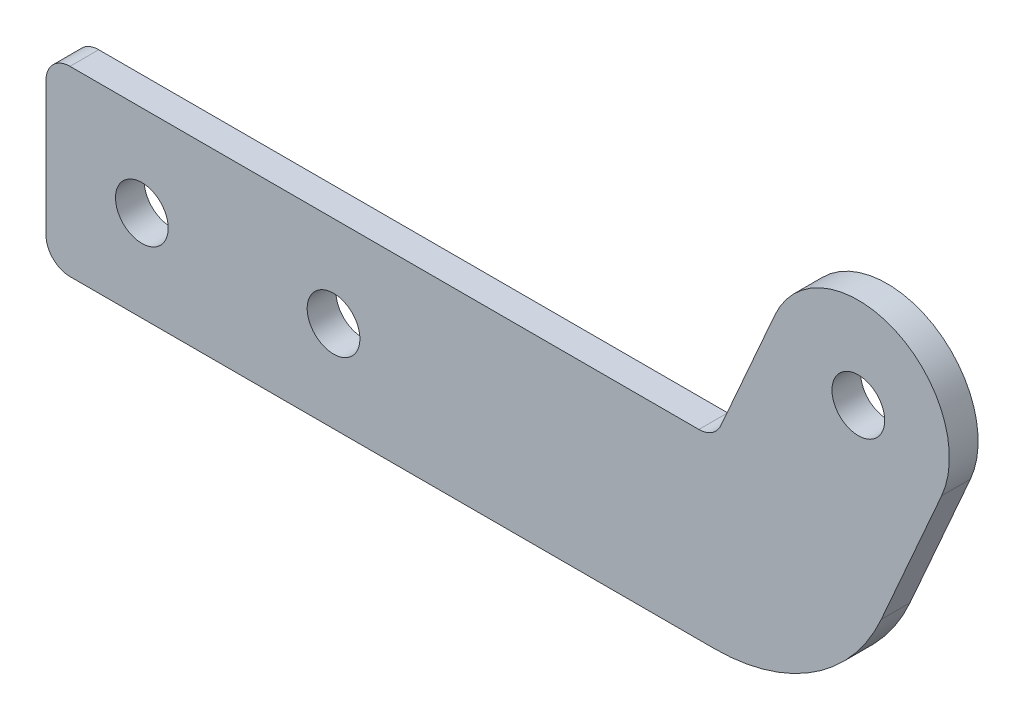
ISO-10303-21;
HEADER;
FILE_DESCRIPTION(('STEP AP214'),'2;1');
FILE_NAME('part.step','',(''),(''),'','','');
FILE_SCHEMA(('AUTOMOTIVE_DESIGN { 1 0 10303 214 1 1 1 1 }'));
ENDSEC;
DATA;
#1=APPLICATION_CONTEXT('core data for automotive mechanical design processes');
#2=APPLICATION_PROTOCOL_DEFINITION('international standard','automotive_design',2000,#1);
#3=PRODUCT_CONTEXT('',#1,'mechanical');
#4=PRODUCT('Part','Part','',(#3));
#5=PRODUCT_RELATED_PRODUCT_CATEGORY('part','',(#4));
#6=PRODUCT_DEFINITION_FORMATION('','',#4);
#7=PRODUCT_DEFINITION_CONTEXT('part definition',#1,'design');
#8=PRODUCT_DEFINITION('design','',#6,#7);
#9=PRODUCT_DEFINITION_SHAPE('','',#8);
#10=(LENGTH_UNIT() NAMED_UNIT(*) SI_UNIT(.MILLI.,.METRE.));
#11=(NAMED_UNIT(*) PLANE_ANGLE_UNIT() SI_UNIT($,.RADIAN.));
#12=(NAMED_UNIT(*) SI_UNIT($,.STERADIAN.) SOLID_ANGLE_UNIT());
#13=UNCERTAINTY_MEASURE_WITH_UNIT(LENGTH_MEASURE(1.E-05),#10,'distance_accuracy_value','');
#14=(GEOMETRIC_REPRESENTATION_CONTEXT(3) GLOBAL_UNCERTAINTY_ASSIGNED_CONTEXT((#13)) GLOBAL_UNIT_ASSIGNED_CONTEXT((#10,
#11,#12)) REPRESENTATION_CONTEXT('',''));
#15=CARTESIAN_POINT('',(0.,0.,0.));
#16=DIRECTION('',(0.,0.,1.));
#17=DIRECTION('',(1.,0.,0.));
#18=AXIS2_PLACEMENT_3D('',#15,#16,#17);
#19=CARTESIAN_POINT('',(-15.,-29.5,3.));
#20=DIRECTION('',(0.,1.,0.));
#21=DIRECTION('',(0.,0.,1.));
#22=AXIS2_PLACEMENT_3D('',#19,#20,#21);
#23=PLANE('',#22);
#24=DIRECTION('',(1.,0.,0.));
#25=VECTOR('',#24,1.);
#26=CARTESIAN_POINT('',(-15.,-29.5,3.));
#27=LINE('',#26,#25);
#28=CARTESIAN_POINT('',(-82.25,-29.5,3.));
#29=VERTEX_POINT('',#28);
#30=CARTESIAN_POINT('',(-15.,-29.5,3.));
#31=VERTEX_POINT('',#30);
#32=EDGE_CURVE('E108',#29,#31,#27,.T.);
#33=ORIENTED_EDGE('',*,*,#32,.F.);
#34=DIRECTION('',(0.,0.,-1.));
#35=VECTOR('',#34,1.);
#36=CARTESIAN_POINT('',(-82.25,-29.5,3.));
#37=LINE('',#36,#35);
#38=CARTESIAN_POINT('',(-82.25,-29.5,0.));
#39=VERTEX_POINT('',#38);
#40=EDGE_CURVE('E134',#29,#39,#37,.T.);
#41=ORIENTED_EDGE('',*,*,#40,.T.);
#42=DIRECTION('',(1.,0.,0.));
#43=VECTOR('',#42,1.);
#44=CARTESIAN_POINT('',(-15.,-29.5,0.));
#45=LINE('',#44,#43);
#46=CARTESIAN_POINT('',(-15.,-29.5,0.));
#47=VERTEX_POINT('',#46);
#48=EDGE_CURVE('E132',#39,#47,#45,.T.);
#49=ORIENTED_EDGE('',*,*,#48,.T.);
#50=DIRECTION('',(0.,0.,-1.));
#51=VECTOR('',#50,1.);
#52=CARTESIAN_POINT('',(-15.,-29.5,3.));
#53=LINE('',#52,#51);
#54=EDGE_CURVE('E125',#31,#47,#53,.T.);
#55=ORIENTED_EDGE('',*,*,#54,.F.);
#56=EDGE_LOOP('',(#33,#41,#49,#55));
#57=FACE_BOUND('',#56,.T.);
#58=ADVANCED_FACE('F33',(#57),#23,.F.);
#59=CARTESIAN_POINT('',(-15.,-10.5,3.));
#60=DIRECTION('',(0.,0.,-1.));
#61=DIRECTION('',(-1.,0.,0.));
#62=AXIS2_PLACEMENT_3D('',#59,#60,#61);
#63=CYLINDRICAL_SURFACE('',#62,19.);
#64=CARTESIAN_POINT('',(-15.,-10.5,0.));
#65=DIRECTION('',(0.,0.,1.));
#66=DIRECTION('',(-1.,0.,0.));
#67=AXIS2_PLACEMENT_3D('',#64,#65,#66);
#68=CIRCLE('',#67,19.);
#69=CARTESIAN_POINT('',(2.39051135146438,-18.1531114544731,0.));
#70=VERTEX_POINT('',#69);
#71=EDGE_CURVE('E189',#47,#70,#68,.T.);
#72=ORIENTED_EDGE('',*,*,#71,.T.);
#73=DIRECTION('',(0.,0.,-1.));
#74=VECTOR('',#73,1.);
#75=CARTESIAN_POINT('',(2.39051135146438,-18.1531114544731,3.));
#76=LINE('',#75,#74);
#77=CARTESIAN_POINT('',(2.39051135146438,-18.1531114544731,3.));
#78=VERTEX_POINT('',#77);
#79=EDGE_CURVE('E127',#78,#70,#76,.T.);
#80=ORIENTED_EDGE('',*,*,#79,.F.);
#81=CARTESIAN_POINT('',(-15.,-10.5,3.));
#82=DIRECTION('',(0.,0.,1.));
#83=DIRECTION('',(-1.,0.,0.));
#84=AXIS2_PLACEMENT_3D('',#81,#82,#83);
#85=CIRCLE('',#84,19.);
#86=EDGE_CURVE('E112',#31,#78,#85,.T.);
#87=ORIENTED_EDGE('',*,*,#86,.F.);
#88=ORIENTED_EDGE('',*,*,#54,.T.);
#89=EDGE_LOOP('',(#72,#80,#87,#88));
#90=FACE_BOUND('',#89,.T.);
#91=ADVANCED_FACE('F124',(#90),#63,.T.);
#92=CARTESIAN_POINT('',(8.69525567573224,-3.82655572723657,3.));
#93=DIRECTION('',(-0.915290071129705,0.402795339709112,0.));
#94=DIRECTION('',(-0.402795339709112,-0.915290071129706,0.));
#95=AXIS2_PLACEMENT_3D('',#92,#93,#94);
#96=PLANE('',#95);
#97=DIRECTION('',(0.402795339709112,0.915290071129706,0.));
#98=VECTOR('',#97,1.);
#99=CARTESIAN_POINT('',(8.69525567573224,-3.82655572723657,0.));
#100=LINE('',#99,#98);
#101=CARTESIAN_POINT('',(8.69525567573224,-3.82655572723657,0.));
#102=VERTEX_POINT('',#101);
#103=EDGE_CURVE('E192',#70,#102,#100,.T.);
#104=ORIENTED_EDGE('',*,*,#103,.T.);
#105=DIRECTION('',(0.,0.,-1.));
#106=VECTOR('',#105,1.);
#107=CARTESIAN_POINT('',(8.69525567573224,-3.82655572723657,3.));
#108=LINE('',#107,#106);
#109=CARTESIAN_POINT('',(8.69525567573224,-3.82655572723657,3.));
#110=VERTEX_POINT('',#109);
#111=EDGE_CURVE('E138',#110,#102,#108,.T.);
#112=ORIENTED_EDGE('',*,*,#111,.F.);
#113=DIRECTION('',(0.402795339709112,0.915290071129706,0.));
#114=VECTOR('',#113,1.);
#115=CARTESIAN_POINT('',(8.69525567573224,-3.82655572723657,3.));
#116=LINE('',#115,#114);
#117=EDGE_CURVE('E129',#78,#110,#116,.T.);
#118=ORIENTED_EDGE('',*,*,#117,.F.);
#119=ORIENTED_EDGE('',*,*,#79,.T.);
#120=EDGE_LOOP('',(#104,#112,#118,#119));
#121=FACE_BOUND('',#120,.T.);
#122=ADVANCED_FACE('F205',(#121),#96,.F.);
#123=CARTESIAN_POINT('',(0.,0.,3.));
#124=DIRECTION('',(0.,0.,-1.));
#125=DIRECTION('',(-1.,0.,0.));
#126=AXIS2_PLACEMENT_3D('',#123,#124,#125);
#127=CYLINDRICAL_SURFACE('',#126,9.50000000000004);
#128=CARTESIAN_POINT('',(0.,0.,0.));
#129=DIRECTION('',(0.,0.,1.));
#130=DIRECTION('',(1.,0.,0.));
#131=AXIS2_PLACEMENT_3D('',#128,#129,#130);
#132=CIRCLE('',#131,9.50000000000004);
#133=CARTESIAN_POINT('',(-8.69525567573223,3.82655572723657,0.));
#134=VERTEX_POINT('',#133);
#135=EDGE_CURVE('E175',#102,#134,#132,.T.);
#136=ORIENTED_EDGE('',*,*,#135,.T.);
#137=DIRECTION('',(0.,0.,-1.));
#138=VECTOR('',#137,1.);
#139=CARTESIAN_POINT('',(-8.69525567573223,3.82655572723657,3.));
#140=LINE('',#139,#138);
#141=CARTESIAN_POINT('',(-8.69525567573223,3.82655572723657,3.));
#142=VERTEX_POINT('',#141);
#143=EDGE_CURVE('E174',#142,#134,#140,.T.);
#144=ORIENTED_EDGE('',*,*,#143,.F.);
#145=CARTESIAN_POINT('',(0.,0.,3.));
#146=DIRECTION('',(0.,0.,1.));
#147=DIRECTION('',(1.,0.,0.));
#148=AXIS2_PLACEMENT_3D('',#145,#146,#147);
#149=CIRCLE('',#148,9.50000000000004);
#150=EDGE_CURVE('E184',#110,#142,#149,.T.);
#151=ORIENTED_EDGE('',*,*,#150,.F.);
#152=ORIENTED_EDGE('',*,*,#111,.T.);
#153=EDGE_LOOP('',(#136,#144,#151,#152));
#154=FACE_BOUND('',#153,.T.);
#155=ADVANCED_FACE('F202',(#154),#127,.T.);
#156=CARTESIAN_POINT('',(-15.,-10.5,3.));
#157=DIRECTION('',(0.915290071129708,-0.402795339709105,0.));
#158=DIRECTION('',(0.402795339709105,0.915290071129709,0.));
#159=AXIS2_PLACEMENT_3D('',#156,#157,#158);
#160=PLANE('',#159);
#161=DIRECTION('',(-0.402795339709105,-0.915290071129708,0.));
#162=VECTOR('',#161,1.);
#163=CARTESIAN_POINT('',(-15.,-10.5,0.));
#164=LINE('',#163,#162);
#165=CARTESIAN_POINT('',(-14.3429644284221,-9.00698834927277,0.));
#166=VERTEX_POINT('',#165);
#167=EDGE_CURVE('E164',#134,#166,#164,.T.);
#168=ORIENTED_EDGE('',*,*,#167,.T.);
#169=DIRECTION('',(0.,0.,-1.));
#170=VECTOR('',#169,1.);
#171=CARTESIAN_POINT('',(-14.3429644284221,-9.00698834927277,3.));
#172=LINE('',#171,#170);
#173=CARTESIAN_POINT('',(-14.3429644284221,-9.00698834927277,3.));
#174=VERTEX_POINT('',#173);
#175=EDGE_CURVE('E157',#166,#174,#172,.F.);
#176=ORIENTED_EDGE('',*,*,#175,.T.);
#177=DIRECTION('',(-0.402795339709105,-0.915290071129708,0.));
#178=VECTOR('',#177,1.);
#179=CARTESIAN_POINT('',(-15.,-10.5,3.));
#180=LINE('',#179,#178);
#181=EDGE_CURVE('E181',#142,#174,#180,.T.);
#182=ORIENTED_EDGE('',*,*,#181,.F.);
#183=ORIENTED_EDGE('',*,*,#143,.T.);
#184=EDGE_LOOP('',(#168,#176,#182,#183));
#185=FACE_BOUND('',#184,.T.);
#186=ADVANCED_FACE('F171',(#185),#160,.F.);
#187=CARTESIAN_POINT('',(-84.75,-10.5,3.));
#188=DIRECTION('',(0.,-1.,0.));
#189=DIRECTION('',(0.,0.,-1.));
#190=AXIS2_PLACEMENT_3D('',#187,#188,#189);
#191=PLANE('',#190);
#192=DIRECTION('',(-1.,0.,0.));
#193=VECTOR('',#192,1.);
#194=CARTESIAN_POINT('',(-84.75,-10.5,0.));
#195=LINE('',#194,#193);
#196=CARTESIAN_POINT('',(-16.6311896062463,-10.5,0.));
#197=VERTEX_POINT('',#196);
#198=CARTESIAN_POINT('',(-82.25,-10.5,0.));
#199=VERTEX_POINT('',#198);
#200=EDGE_CURVE('E165',#197,#199,#195,.T.);
#201=ORIENTED_EDGE('',*,*,#200,.T.);
#202=DIRECTION('',(0.,0.,-1.));
#203=VECTOR('',#202,1.);
#204=CARTESIAN_POINT('',(-82.25,-10.5,3.));
#205=LINE('',#204,#203);
#206=CARTESIAN_POINT('',(-82.25,-10.5,3.));
#207=VERTEX_POINT('',#206);
#208=EDGE_CURVE('E48',#199,#207,#205,.F.);
#209=ORIENTED_EDGE('',*,*,#208,.T.);
#210=DIRECTION('',(-1.,0.,0.));
#211=VECTOR('',#210,1.);
#212=CARTESIAN_POINT('',(-84.75,-10.5,3.));
#213=LINE('',#212,#211);
#214=CARTESIAN_POINT('',(-16.6311896062463,-10.5,3.));
#215=VERTEX_POINT('',#214);
#216=EDGE_CURVE('E178',#215,#207,#213,.T.);
#217=ORIENTED_EDGE('',*,*,#216,.F.);
#218=DIRECTION('',(0.,0.,-1.));
#219=VECTOR('',#218,1.);
#220=CARTESIAN_POINT('',(-16.6311896062463,-10.5,0.));
#221=LINE('',#220,#219);
#222=EDGE_CURVE('E153',#215,#197,#221,.T.);
#223=ORIENTED_EDGE('',*,*,#222,.T.);
#224=EDGE_LOOP('',(#201,#209,#217,#223));
#225=FACE_BOUND('',#224,.T.);
#226=ADVANCED_FACE('F177',(#225),#191,.F.);
#227=CARTESIAN_POINT('',(-84.75,-10.5,3.));
#228=DIRECTION('',(1.,0.,0.));
#229=DIRECTION('',(0.,0.,-1.));
#230=AXIS2_PLACEMENT_3D('',#227,#228,#229);
#231=PLANE('',#230);
#232=DIRECTION('',(0.,-1.,0.));
#233=VECTOR('',#232,1.);
#234=CARTESIAN_POINT('',(-84.75,-10.5,0.));
#235=LINE('',#234,#233);
#236=CARTESIAN_POINT('',(-84.75,-13.,0.));
#237=VERTEX_POINT('',#236);
#238=CARTESIAN_POINT('',(-84.75,-27.,0.));
#239=VERTEX_POINT('',#238);
#240=EDGE_CURVE('E120',#237,#239,#235,.T.);
#241=ORIENTED_EDGE('',*,*,#240,.T.);
#242=DIRECTION('',(0.,0.,-1.));
#243=VECTOR('',#242,1.);
#244=CARTESIAN_POINT('',(-84.75,-27.,3.));
#245=LINE('',#244,#243);
#246=CARTESIAN_POINT('',(-84.75,-27.,3.));
#247=VERTEX_POINT('',#246);
#248=EDGE_CURVE('E148',#239,#247,#245,.F.);
#249=ORIENTED_EDGE('',*,*,#248,.T.);
#250=DIRECTION('',(0.,-1.,0.));
#251=VECTOR('',#250,1.);
#252=CARTESIAN_POINT('',(-84.75,-10.5,3.));
#253=LINE('',#252,#251);
#254=CARTESIAN_POINT('',(-84.75,-13.,3.));
#255=VERTEX_POINT('',#254);
#256=EDGE_CURVE('E180',#255,#247,#253,.T.);
#257=ORIENTED_EDGE('',*,*,#256,.F.);
#258=DIRECTION('',(0.,0.,-1.));
#259=VECTOR('',#258,1.);
#260=CARTESIAN_POINT('',(-84.75,-13.,3.));
#261=LINE('',#260,#259);
#262=EDGE_CURVE('E145',#255,#237,#261,.T.);
#263=ORIENTED_EDGE('',*,*,#262,.T.);
#264=EDGE_LOOP('',(#241,#249,#257,#263));
#265=FACE_BOUND('',#264,.T.);
#266=ADVANCED_FACE('F230',(#265),#231,.F.);
#267=CARTESIAN_POINT('',(0.,0.,3.));
#268=DIRECTION('',(0.,0.,1.));
#269=DIRECTION('',(1.,0.,0.));
#270=AXIS2_PLACEMENT_3D('',#267,#268,#269);
#271=PLANE('',#270);
#272=CARTESIAN_POINT('',(0.,0.,3.));
#273=DIRECTION('',(0.,0.,1.));
#274=DIRECTION('',(1.,0.,0.));
#275=AXIS2_PLACEMENT_3D('',#272,#273,#274);
#276=CIRCLE('',#275,2.74999999999999);
#277=CARTESIAN_POINT('',(2.74999999999999,0.,3.));
#278=VERTEX_POINT('',#277);
#279=EDGE_CURVE('E222',#278,#278,#276,.T.);
#280=ORIENTED_EDGE('',*,*,#279,.F.);
#281=EDGE_LOOP('',(#280));
#282=FACE_BOUND('',#281,.T.);
#283=CARTESIAN_POINT('',(-54.75,-20.,3.));
#284=DIRECTION('',(0.,0.,1.));
#285=DIRECTION('',(1.,0.,0.));
#286=AXIS2_PLACEMENT_3D('',#283,#284,#285);
#287=CIRCLE('',#286,2.74999999999999);
#288=CARTESIAN_POINT('',(-52.,-20.,3.));
#289=VERTEX_POINT('',#288);
#290=EDGE_CURVE('E216',#289,#289,#287,.T.);
#291=ORIENTED_EDGE('',*,*,#290,.F.);
#292=EDGE_LOOP('',(#291));
#293=FACE_BOUND('',#292,.T.);
#294=CARTESIAN_POINT('',(-74.75,-20.,3.));
#295=DIRECTION('',(0.,0.,1.));
#296=DIRECTION('',(1.,0.,0.));
#297=AXIS2_PLACEMENT_3D('',#294,#295,#296);
#298=CIRCLE('',#297,2.74999999999999);
#299=CARTESIAN_POINT('',(-72.,-20.,3.));
#300=VERTEX_POINT('',#299);
#301=EDGE_CURVE('E210',#300,#300,#298,.T.);
#302=ORIENTED_EDGE('',*,*,#301,.F.);
#303=EDGE_LOOP('',(#302));
#304=FACE_BOUND('',#303,.T.);
#305=ORIENTED_EDGE('',*,*,#256,.T.);
#306=CARTESIAN_POINT('',(-82.25,-27.,3.));
#307=DIRECTION('',(0.,0.,1.));
#308=DIRECTION('',(1.,0.,0.));
#309=AXIS2_PLACEMENT_3D('',#306,#307,#308);
#310=CIRCLE('',#309,2.5);
#311=EDGE_CURVE('E115',#247,#29,#310,.T.);
#312=ORIENTED_EDGE('',*,*,#311,.T.);
#313=ORIENTED_EDGE('',*,*,#32,.T.);
#314=ORIENTED_EDGE('',*,*,#86,.T.);
#315=ORIENTED_EDGE('',*,*,#117,.T.);
#316=ORIENTED_EDGE('',*,*,#150,.T.);
#317=ORIENTED_EDGE('',*,*,#181,.T.);
#318=CARTESIAN_POINT('',(-16.6311896062463,-8.00000000000001,3.));
#319=DIRECTION('',(0.,0.,1.));
#320=DIRECTION('',(1.,0.,0.));
#321=AXIS2_PLACEMENT_3D('',#318,#319,#320);
#322=CIRCLE('',#321,2.5);
#323=EDGE_CURVE('E11',#174,#215,#322,.F.);
#324=ORIENTED_EDGE('',*,*,#323,.T.);
#325=ORIENTED_EDGE('',*,*,#216,.T.);
#326=CARTESIAN_POINT('',(-82.25,-13.,3.));
#327=DIRECTION('',(0.,0.,1.));
#328=DIRECTION('',(1.,0.,0.));
#329=AXIS2_PLACEMENT_3D('',#326,#327,#328);
#330=CIRCLE('',#329,2.5);
#331=EDGE_CURVE('E150',#207,#255,#330,.T.);
#332=ORIENTED_EDGE('',*,*,#331,.T.);
#333=EDGE_LOOP('',(#305,#312,#313,#314,#315,#316,#317,#324,#325,#332));
#334=FACE_BOUND('',#333,.T.);
#335=ADVANCED_FACE('F111',(#282,#293,#304,#334),#271,.T.);
#336=CARTESIAN_POINT('',(0.,0.,0.));
#337=DIRECTION('',(0.,0.,1.));
#338=DIRECTION('',(1.,0.,0.));
#339=AXIS2_PLACEMENT_3D('',#336,#337,#338);
#340=PLANE('',#339);
#341=CARTESIAN_POINT('',(0.,0.,0.));
#342=DIRECTION('',(0.,0.,1.));
#343=DIRECTION('',(1.,0.,0.));
#344=AXIS2_PLACEMENT_3D('',#341,#342,#343);
#345=CIRCLE('',#344,2.74999999999999);
#346=CARTESIAN_POINT('',(2.74999999999999,0.,0.));
#347=VERTEX_POINT('',#346);
#348=EDGE_CURVE('E219',#347,#347,#345,.T.);
#349=ORIENTED_EDGE('',*,*,#348,.T.);
#350=EDGE_LOOP('',(#349));
#351=FACE_BOUND('',#350,.T.);
#352=CARTESIAN_POINT('',(-54.75,-20.,0.));
#353=DIRECTION('',(0.,0.,1.));
#354=DIRECTION('',(1.,0.,0.));
#355=AXIS2_PLACEMENT_3D('',#352,#353,#354);
#356=CIRCLE('',#355,2.75);
#357=CARTESIAN_POINT('',(-52.,-20.,0.));
#358=VERTEX_POINT('',#357);
#359=EDGE_CURVE('E213',#358,#358,#356,.T.);
#360=ORIENTED_EDGE('',*,*,#359,.T.);
#361=EDGE_LOOP('',(#360));
#362=FACE_BOUND('',#361,.T.);
#363=CARTESIAN_POINT('',(-74.75,-20.,0.));
#364=DIRECTION('',(0.,0.,1.));
#365=DIRECTION('',(1.,0.,0.));
#366=AXIS2_PLACEMENT_3D('',#363,#364,#365);
#367=CIRCLE('',#366,2.75);
#368=CARTESIAN_POINT('',(-72.,-20.,0.));
#369=VERTEX_POINT('',#368);
#370=EDGE_CURVE('E190',#369,#369,#367,.T.);
#371=ORIENTED_EDGE('',*,*,#370,.T.);
#372=EDGE_LOOP('',(#371));
#373=FACE_BOUND('',#372,.T.);
#374=ORIENTED_EDGE('',*,*,#48,.F.);
#375=CARTESIAN_POINT('',(-82.25,-27.,0.));
#376=DIRECTION('',(0.,0.,1.));
#377=DIRECTION('',(1.,0.,0.));
#378=AXIS2_PLACEMENT_3D('',#375,#376,#377);
#379=CIRCLE('',#378,2.5);
#380=EDGE_CURVE('E143',#39,#239,#379,.F.);
#381=ORIENTED_EDGE('',*,*,#380,.T.);
#382=ORIENTED_EDGE('',*,*,#240,.F.);
#383=CARTESIAN_POINT('',(-82.25,-13.,0.));
#384=DIRECTION('',(0.,0.,1.));
#385=DIRECTION('',(1.,0.,0.));
#386=AXIS2_PLACEMENT_3D('',#383,#384,#385);
#387=CIRCLE('',#386,2.5);
#388=EDGE_CURVE('E136',#237,#199,#387,.F.);
#389=ORIENTED_EDGE('',*,*,#388,.T.);
#390=ORIENTED_EDGE('',*,*,#200,.F.);
#391=CARTESIAN_POINT('',(-16.6311896062463,-8.00000000000001,0.));
#392=DIRECTION('',(0.,0.,1.));
#393=DIRECTION('',(1.,0.,0.));
#394=AXIS2_PLACEMENT_3D('',#391,#392,#393);
#395=CIRCLE('',#394,2.5);
#396=EDGE_CURVE('E41',#197,#166,#395,.T.);
#397=ORIENTED_EDGE('',*,*,#396,.T.);
#398=ORIENTED_EDGE('',*,*,#167,.F.);
#399=ORIENTED_EDGE('',*,*,#135,.F.);
#400=ORIENTED_EDGE('',*,*,#103,.F.);
#401=ORIENTED_EDGE('',*,*,#71,.F.);
#402=EDGE_LOOP('',(#374,#381,#382,#389,#390,#397,#398,#399,#400,#401));
#403=FACE_BOUND('',#402,.T.);
#404=ADVANCED_FACE('F162',(#351,#362,#373,#403),#340,.F.);
#405=CARTESIAN_POINT('',(-74.75,-20.,3.));
#406=DIRECTION('',(0.,0.,1.));
#407=DIRECTION('',(1.,0.,0.));
#408=AXIS2_PLACEMENT_3D('',#405,#406,#407);
#409=CYLINDRICAL_SURFACE('',#408,2.75);
#410=ORIENTED_EDGE('',*,*,#370,.F.);
#411=EDGE_LOOP('',(#410));
#412=FACE_BOUND('',#411,.T.);
#413=ORIENTED_EDGE('',*,*,#301,.T.);
#414=EDGE_LOOP('',(#413));
#415=FACE_BOUND('',#414,.T.);
#416=ADVANCED_FACE('F236',(#412,#415),#409,.F.);
#417=CARTESIAN_POINT('',(-54.75,-20.,3.));
#418=DIRECTION('',(0.,0.,1.));
#419=DIRECTION('',(1.,0.,0.));
#420=AXIS2_PLACEMENT_3D('',#417,#418,#419);
#421=CYLINDRICAL_SURFACE('',#420,2.75);
#422=ORIENTED_EDGE('',*,*,#359,.F.);
#423=EDGE_LOOP('',(#422));
#424=FACE_BOUND('',#423,.T.);
#425=ORIENTED_EDGE('',*,*,#290,.T.);
#426=EDGE_LOOP('',(#425));
#427=FACE_BOUND('',#426,.T.);
#428=ADVANCED_FACE('F238',(#424,#427),#421,.F.);
#429=CARTESIAN_POINT('',(0.,0.,3.));
#430=DIRECTION('',(0.,0.,1.));
#431=DIRECTION('',(1.,0.,0.));
#432=AXIS2_PLACEMENT_3D('',#429,#430,#431);
#433=CYLINDRICAL_SURFACE('',#432,2.74999999999999);
#434=ORIENTED_EDGE('',*,*,#348,.F.);
#435=EDGE_LOOP('',(#434));
#436=FACE_BOUND('',#435,.T.);
#437=ORIENTED_EDGE('',*,*,#279,.T.);
#438=EDGE_LOOP('',(#437));
#439=FACE_BOUND('',#438,.T.);
#440=ADVANCED_FACE('F226',(#436,#439),#433,.F.);
#441=CARTESIAN_POINT('',(-82.25,-27.,3.));
#442=DIRECTION('',(0.,0.,-1.));
#443=DIRECTION('',(-1.,0.,0.));
#444=AXIS2_PLACEMENT_3D('',#441,#442,#443);
#445=CYLINDRICAL_SURFACE('',#444,2.5);
#446=ORIENTED_EDGE('',*,*,#311,.F.);
#447=ORIENTED_EDGE('',*,*,#248,.F.);
#448=ORIENTED_EDGE('',*,*,#380,.F.);
#449=ORIENTED_EDGE('',*,*,#40,.F.);
#450=EDGE_LOOP('',(#446,#447,#448,#449));
#451=FACE_BOUND('',#450,.T.);
#452=ADVANCED_FACE('F258',(#451),#445,.T.);
#453=CARTESIAN_POINT('',(-82.25,-13.,3.));
#454=DIRECTION('',(0.,0.,-1.));
#455=DIRECTION('',(-1.,0.,0.));
#456=AXIS2_PLACEMENT_3D('',#453,#454,#455);
#457=CYLINDRICAL_SURFACE('',#456,2.5);
#458=ORIENTED_EDGE('',*,*,#331,.F.);
#459=ORIENTED_EDGE('',*,*,#208,.F.);
#460=ORIENTED_EDGE('',*,*,#388,.F.);
#461=ORIENTED_EDGE('',*,*,#262,.F.);
#462=EDGE_LOOP('',(#458,#459,#460,#461));
#463=FACE_BOUND('',#462,.T.);
#464=ADVANCED_FACE('F260',(#463),#457,.T.);
#465=CARTESIAN_POINT('',(-16.6311896062463,-8.00000000000001,3.));
#466=DIRECTION('',(0.,0.,1.));
#467=DIRECTION('',(1.,0.,0.));
#468=AXIS2_PLACEMENT_3D('',#465,#466,#467);
#469=CYLINDRICAL_SURFACE('',#468,2.5);
#470=ORIENTED_EDGE('',*,*,#323,.F.);
#471=ORIENTED_EDGE('',*,*,#175,.F.);
#472=ORIENTED_EDGE('',*,*,#396,.F.);
#473=ORIENTED_EDGE('',*,*,#222,.F.);
#474=EDGE_LOOP('',(#470,#471,#472,#473));
#475=FACE_BOUND('',#474,.T.);
#476=ADVANCED_FACE('F35',(#475),#469,.F.);
#477=CLOSED_SHELL('',(#58,#91,#122,#155,#186,#226,#266,#335,#404,#416,#428,#440,#452,#464,#476));
#478=MANIFOLD_SOLID_BREP('B2',#477);
#479=ADVANCED_BREP_SHAPE_REPRESENTATION('',(#18,#478),#14);
#480=SHAPE_DEFINITION_REPRESENTATION(#9,#479);
ENDSEC;
END-ISO-10303-21;
